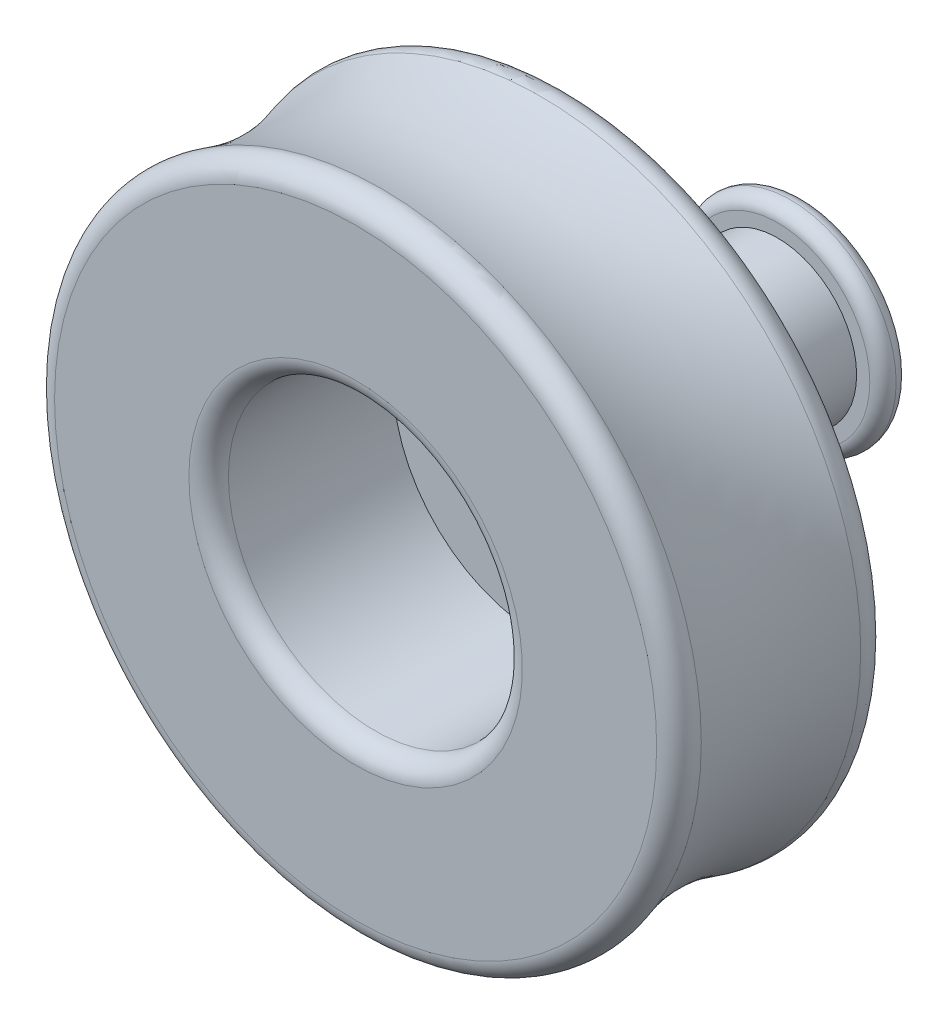
ISO-10303-21;
HEADER;
FILE_DESCRIPTION(('STEP AP214'),'2;1');
FILE_NAME('part.step','',(''),(''),'','','');
FILE_SCHEMA(('AUTOMOTIVE_DESIGN { 1 0 10303 214 1 1 1 1 }'));
ENDSEC;
DATA;
#1=APPLICATION_CONTEXT('core data for automotive mechanical design processes');
#2=APPLICATION_PROTOCOL_DEFINITION('international standard','automotive_design',2000,#1);
#3=PRODUCT_CONTEXT('',#1,'mechanical');
#4=PRODUCT('Part','Part','',(#3));
#5=PRODUCT_RELATED_PRODUCT_CATEGORY('part','',(#4));
#6=PRODUCT_DEFINITION_FORMATION('','',#4);
#7=PRODUCT_DEFINITION_CONTEXT('part definition',#1,'design');
#8=PRODUCT_DEFINITION('design','',#6,#7);
#9=PRODUCT_DEFINITION_SHAPE('','',#8);
#10=(LENGTH_UNIT() NAMED_UNIT(*) SI_UNIT(.MILLI.,.METRE.));
#11=(NAMED_UNIT(*) PLANE_ANGLE_UNIT() SI_UNIT($,.RADIAN.));
#12=(NAMED_UNIT(*) SI_UNIT($,.STERADIAN.) SOLID_ANGLE_UNIT());
#13=UNCERTAINTY_MEASURE_WITH_UNIT(LENGTH_MEASURE(1.E-05),#10,'distance_accuracy_value','');
#14=(GEOMETRIC_REPRESENTATION_CONTEXT(3) GLOBAL_UNCERTAINTY_ASSIGNED_CONTEXT((#13)) GLOBAL_UNIT_ASSIGNED_CONTEXT((#10,
#11,#12)) REPRESENTATION_CONTEXT('',''));
#15=CARTESIAN_POINT('',(0.,0.,0.));
#16=DIRECTION('',(0.,0.,1.));
#17=DIRECTION('',(1.,0.,0.));
#18=AXIS2_PLACEMENT_3D('',#15,#16,#17);
#19=CARTESIAN_POINT('',(0.,0.,-24.));
#20=DIRECTION('',(0.,0.,1.));
#21=DIRECTION('',(1.,0.,0.));
#22=AXIS2_PLACEMENT_3D('',#19,#20,#21);
#23=PLANE('',#22);
#24=CARTESIAN_POINT('',(12.5,0.,-24.));
#25=DIRECTION('',(0.,0.,1.));
#26=DIRECTION('',(1.,0.,0.));
#27=AXIS2_PLACEMENT_3D('',#24,#25,#26);
#28=CIRCLE('',#27,7.00000000000001);
#29=CARTESIAN_POINT('',(19.5,0.,-24.));
#30=VERTEX_POINT('',#29);
#31=EDGE_CURVE('E61',#30,#30,#28,.T.);
#32=ORIENTED_EDGE('',*,*,#31,.T.);
#33=EDGE_LOOP('',(#32));
#34=FACE_BOUND('',#33,.T.);
#35=CARTESIAN_POINT('',(12.5,0.,-24.));
#36=DIRECTION('',(0.,0.,1.));
#37=DIRECTION('',(1.,0.,0.));
#38=AXIS2_PLACEMENT_3D('',#35,#36,#37);
#39=CIRCLE('',#38,6.);
#40=CARTESIAN_POINT('',(18.5,0.,-24.));
#41=VERTEX_POINT('',#40);
#42=EDGE_CURVE('E116',#41,#41,#39,.T.);
#43=ORIENTED_EDGE('',*,*,#42,.F.);
#44=EDGE_LOOP('',(#43));
#45=FACE_BOUND('',#44,.T.);
#46=ADVANCED_FACE('F43',(#34,#45),#23,.T.);
#47=CARTESIAN_POINT('',(0.,0.,-26.));
#48=DIRECTION('',(0.,0.,1.));
#49=DIRECTION('',(1.,0.,0.));
#50=AXIS2_PLACEMENT_3D('',#47,#48,#49);
#51=PLANE('',#50);
#52=CARTESIAN_POINT('',(12.5,0.,-26.));
#53=DIRECTION('',(0.,0.,1.));
#54=DIRECTION('',(1.,0.,0.));
#55=AXIS2_PLACEMENT_3D('',#52,#53,#54);
#56=CIRCLE('',#55,5.75);
#57=CARTESIAN_POINT('',(18.25,0.,-26.));
#58=VERTEX_POINT('',#57);
#59=EDGE_CURVE('E51',#58,#58,#56,.T.);
#60=ORIENTED_EDGE('',*,*,#59,.T.);
#61=EDGE_LOOP('',(#60));
#62=FACE_BOUND('',#61,.T.);
#63=CARTESIAN_POINT('',(12.5,0.,-26.));
#64=DIRECTION('',(0.,0.,1.));
#65=DIRECTION('',(1.,0.,0.));
#66=AXIS2_PLACEMENT_3D('',#63,#64,#65);
#67=CIRCLE('',#66,7.00000000000001);
#68=CARTESIAN_POINT('',(19.5,0.,-26.));
#69=VERTEX_POINT('',#68);
#70=EDGE_CURVE('E56',#69,#69,#67,.F.);
#71=ORIENTED_EDGE('',*,*,#70,.T.);
#72=EDGE_LOOP('',(#71));
#73=FACE_BOUND('',#72,.T.);
#74=ADVANCED_FACE('F143',(#62,#73),#51,.F.);
#75=CARTESIAN_POINT('',(0.,0.,8.));
#76=DIRECTION('',(0.,0.,-1.));
#77=DIRECTION('',(-1.,0.,0.));
#78=AXIS2_PLACEMENT_3D('',#75,#76,#77);
#79=PLANE('',#78);
#80=CARTESIAN_POINT('',(12.5,0.,8.));
#81=DIRECTION('',(0.,0.,-1.));
#82=DIRECTION('',(-1.,0.,0.));
#83=AXIS2_PLACEMENT_3D('',#80,#81,#82);
#84=CIRCLE('',#83,22.8364012479042);
#85=CARTESIAN_POINT('',(-10.3364012479042,0.,8.));
#86=VERTEX_POINT('',#85);
#87=EDGE_CURVE('E88',#86,#86,#84,.F.);
#88=ORIENTED_EDGE('',*,*,#87,.T.);
#89=EDGE_LOOP('',(#88));
#90=FACE_BOUND('',#89,.T.);
#91=CARTESIAN_POINT('',(12.5,0.,8.));
#92=DIRECTION('',(0.,0.,-1.));
#93=DIRECTION('',(-1.,0.,0.));
#94=AXIS2_PLACEMENT_3D('',#91,#92,#93);
#95=CIRCLE('',#94,12.65);
#96=CARTESIAN_POINT('',(-0.150000000000003,0.,8.));
#97=VERTEX_POINT('',#96);
#98=EDGE_CURVE('E92',#97,#97,#95,.T.);
#99=ORIENTED_EDGE('',*,*,#98,.T.);
#100=EDGE_LOOP('',(#99));
#101=FACE_BOUND('',#100,.T.);
#102=ADVANCED_FACE('F156',(#90,#101),#79,.F.);
#103=CARTESIAN_POINT('',(12.5,0.,0.));
#104=DIRECTION('',(0.,0.,1.));
#105=DIRECTION('',(1.,0.,0.));
#106=AXIS2_PLACEMENT_3D('',#103,#104,#105);
#107=TOROIDAL_SURFACE('',#106,43.3303027798234,20.);
#108=CARTESIAN_POINT('',(12.5,0.,-6.04651162790698));
#109=DIRECTION('',(0.,0.,1.));
#110=DIRECTION('',(1.,0.,0.));
#111=AXIS2_PLACEMENT_3D('',#108,#109,#110);
#112=CIRCLE('',#111,24.2662083315264);
#113=CARTESIAN_POINT('',(36.7662083315264,0.,-6.04651162790698));
#114=VERTEX_POINT('',#113);
#115=EDGE_CURVE('E100',#114,#114,#112,.T.);
#116=ORIENTED_EDGE('',*,*,#115,.T.);
#117=EDGE_LOOP('',(#116));
#118=FACE_BOUND('',#117,.T.);
#119=CARTESIAN_POINT('',(12.5,0.,6.04651162790698));
#120=DIRECTION('',(0.,0.,-1.));
#121=DIRECTION('',(-1.,0.,0.));
#122=AXIS2_PLACEMENT_3D('',#119,#120,#121);
#123=CIRCLE('',#122,24.2662083315264);
#124=CARTESIAN_POINT('',(-11.7662083315264,0.,6.04651162790698));
#125=VERTEX_POINT('',#124);
#126=EDGE_CURVE('E104',#125,#125,#123,.T.);
#127=ORIENTED_EDGE('',*,*,#126,.T.);
#128=EDGE_LOOP('',(#127));
#129=FACE_BOUND('',#128,.T.);
#130=ADVANCED_FACE('F159',(#118,#129),#107,.F.);
#131=CARTESIAN_POINT('',(0.,0.,-8.));
#132=DIRECTION('',(0.,0.,-1.));
#133=DIRECTION('',(-1.,0.,0.));
#134=AXIS2_PLACEMENT_3D('',#131,#132,#133);
#135=PLANE('',#134);
#136=CARTESIAN_POINT('',(12.5,0.,-8.));
#137=DIRECTION('',(0.,0.,-1.));
#138=DIRECTION('',(-1.,0.,0.));
#139=AXIS2_PLACEMENT_3D('',#136,#137,#138);
#140=CIRCLE('',#139,22.8364012479042);
#141=CARTESIAN_POINT('',(-10.3364012479042,0.,-8.));
#142=VERTEX_POINT('',#141);
#143=EDGE_CURVE('E96',#142,#142,#140,.T.);
#144=ORIENTED_EDGE('',*,*,#143,.T.);
#145=EDGE_LOOP('',(#144));
#146=FACE_BOUND('',#145,.T.);
#147=CARTESIAN_POINT('',(12.5,0.,-8.));
#148=DIRECTION('',(0.,0.,1.));
#149=DIRECTION('',(1.,0.,0.));
#150=AXIS2_PLACEMENT_3D('',#147,#148,#149);
#151=CIRCLE('',#150,6.);
#152=CARTESIAN_POINT('',(18.5,0.,-8.));
#153=VERTEX_POINT('',#152);
#154=EDGE_CURVE('E128',#153,#153,#151,.T.);
#155=ORIENTED_EDGE('',*,*,#154,.T.);
#156=EDGE_LOOP('',(#155));
#157=FACE_BOUND('',#156,.T.);
#158=ADVANCED_FACE('F165',(#146,#157),#135,.T.);
#159=CARTESIAN_POINT('',(12.5,0.,8.));
#160=DIRECTION('',(0.,0.,1.));
#161=DIRECTION('',(1.,0.,0.));
#162=AXIS2_PLACEMENT_3D('',#159,#160,#161);
#163=CYLINDRICAL_SURFACE('',#162,6.);
#164=CARTESIAN_POINT('',(12.5,0.,-15.));
#165=DIRECTION('',(0.,0.,1.));
#166=DIRECTION('',(1.,0.,0.));
#167=AXIS2_PLACEMENT_3D('',#164,#165,#166);
#168=CIRCLE('',#167,6.);
#169=CARTESIAN_POINT('',(18.5,0.,-15.));
#170=VERTEX_POINT('',#169);
#171=EDGE_CURVE('E124',#170,#170,#168,.T.);
#172=ORIENTED_EDGE('',*,*,#171,.T.);
#173=EDGE_LOOP('',(#172));
#174=FACE_BOUND('',#173,.T.);
#175=ORIENTED_EDGE('',*,*,#154,.F.);
#176=EDGE_LOOP('',(#175));
#177=FACE_BOUND('',#176,.T.);
#178=ADVANCED_FACE('F173',(#174,#177),#163,.T.);
#179=CARTESIAN_POINT('',(0.,0.,-15.));
#180=DIRECTION('',(0.,0.,1.));
#181=DIRECTION('',(1.,0.,0.));
#182=AXIS2_PLACEMENT_3D('',#179,#180,#181);
#183=PLANE('',#182);
#184=CARTESIAN_POINT('',(12.5,0.,-15.));
#185=DIRECTION('',(0.,0.,1.));
#186=DIRECTION('',(1.,0.,0.));
#187=AXIS2_PLACEMENT_3D('',#184,#185,#186);
#188=CIRCLE('',#187,7.);
#189=CARTESIAN_POINT('',(19.5,0.,-15.));
#190=VERTEX_POINT('',#189);
#191=EDGE_CURVE('E80',#190,#190,#188,.T.);
#192=ORIENTED_EDGE('',*,*,#191,.T.);
#193=EDGE_LOOP('',(#192));
#194=FACE_BOUND('',#193,.T.);
#195=ORIENTED_EDGE('',*,*,#171,.F.);
#196=EDGE_LOOP('',(#195));
#197=FACE_BOUND('',#196,.T.);
#198=ADVANCED_FACE('F220',(#194,#197),#183,.T.);
#199=CARTESIAN_POINT('',(0.,0.,-17.));
#200=DIRECTION('',(0.,0.,1.));
#201=DIRECTION('',(1.,0.,0.));
#202=AXIS2_PLACEMENT_3D('',#199,#200,#201);
#203=PLANE('',#202);
#204=CARTESIAN_POINT('',(12.5,0.,-17.));
#205=DIRECTION('',(0.,0.,1.));
#206=DIRECTION('',(1.,0.,0.));
#207=AXIS2_PLACEMENT_3D('',#204,#205,#206);
#208=CIRCLE('',#207,7.);
#209=CARTESIAN_POINT('',(19.5,0.,-17.));
#210=VERTEX_POINT('',#209);
#211=EDGE_CURVE('E76',#210,#210,#208,.F.);
#212=ORIENTED_EDGE('',*,*,#211,.T.);
#213=EDGE_LOOP('',(#212));
#214=FACE_BOUND('',#213,.T.);
#215=CARTESIAN_POINT('',(12.5,0.,-17.));
#216=DIRECTION('',(0.,0.,1.));
#217=DIRECTION('',(1.,0.,0.));
#218=AXIS2_PLACEMENT_3D('',#215,#216,#217);
#219=CIRCLE('',#218,6.);
#220=CARTESIAN_POINT('',(18.5,0.,-17.));
#221=VERTEX_POINT('',#220);
#222=EDGE_CURVE('E120',#221,#221,#219,.T.);
#223=ORIENTED_EDGE('',*,*,#222,.T.);
#224=EDGE_LOOP('',(#223));
#225=FACE_BOUND('',#224,.T.);
#226=ADVANCED_FACE('F151',(#214,#225),#203,.F.);
#227=CARTESIAN_POINT('',(12.5,0.,8.));
#228=DIRECTION('',(0.,0.,1.));
#229=DIRECTION('',(1.,0.,0.));
#230=AXIS2_PLACEMENT_3D('',#227,#228,#229);
#231=CYLINDRICAL_SURFACE('',#230,6.);
#232=ORIENTED_EDGE('',*,*,#42,.T.);
#233=EDGE_LOOP('',(#232));
#234=FACE_BOUND('',#233,.T.);
#235=ORIENTED_EDGE('',*,*,#222,.F.);
#236=EDGE_LOOP('',(#235));
#237=FACE_BOUND('',#236,.T.);
#238=ADVANCED_FACE('F140',(#234,#237),#231,.T.);
#239=CARTESIAN_POINT('',(12.5,0.,-6.));
#240=DIRECTION('',(0.,0.,1.));
#241=DIRECTION('',(1.,0.,0.));
#242=AXIS2_PLACEMENT_3D('',#239,#240,#241);
#243=CYLINDRICAL_SURFACE('',#242,11.15);
#244=CARTESIAN_POINT('',(12.5,0.,6.5));
#245=DIRECTION('',(0.,0.,-1.));
#246=DIRECTION('',(-1.,0.,0.));
#247=AXIS2_PLACEMENT_3D('',#244,#245,#246);
#248=CIRCLE('',#247,11.15);
#249=CARTESIAN_POINT('',(1.35,0.,6.5));
#250=VERTEX_POINT('',#249);
#251=EDGE_CURVE('E84',#250,#250,#248,.F.);
#252=ORIENTED_EDGE('',*,*,#251,.T.);
#253=EDGE_LOOP('',(#252));
#254=FACE_BOUND('',#253,.T.);
#255=CARTESIAN_POINT('',(12.5,0.,-6.));
#256=DIRECTION('',(0.,0.,1.));
#257=DIRECTION('',(1.,0.,0.));
#258=AXIS2_PLACEMENT_3D('',#255,#256,#257);
#259=CIRCLE('',#258,11.15);
#260=CARTESIAN_POINT('',(23.65,0.,-6.));
#261=VERTEX_POINT('',#260);
#262=EDGE_CURVE('E71',#261,#261,#259,.T.);
#263=ORIENTED_EDGE('',*,*,#262,.F.);
#264=EDGE_LOOP('',(#263));
#265=FACE_BOUND('',#264,.T.);
#266=ADVANCED_FACE('F138',(#254,#265),#243,.F.);
#267=CARTESIAN_POINT('',(12.5,0.,-6.));
#268=DIRECTION('',(0.,0.,1.));
#269=DIRECTION('',(1.,0.,0.));
#270=AXIS2_PLACEMENT_3D('',#267,#268,#269);
#271=PLANE('',#270);
#272=CARTESIAN_POINT('',(12.5,0.,-6.));
#273=DIRECTION('',(0.,0.,1.));
#274=DIRECTION('',(1.,0.,0.));
#275=AXIS2_PLACEMENT_3D('',#272,#273,#274);
#276=CIRCLE('',#275,5.75);
#277=CARTESIAN_POINT('',(18.25,0.,-6.));
#278=VERTEX_POINT('',#277);
#279=EDGE_CURVE('E108',#278,#278,#276,.F.);
#280=ORIENTED_EDGE('',*,*,#279,.T.);
#281=EDGE_LOOP('',(#280));
#282=FACE_BOUND('',#281,.T.);
#283=ORIENTED_EDGE('',*,*,#262,.T.);
#284=EDGE_LOOP('',(#283));
#285=FACE_BOUND('',#284,.T.);
#286=ADVANCED_FACE('F136',(#282,#285),#271,.T.);
#287=CARTESIAN_POINT('',(12.5,0.,-26.));
#288=DIRECTION('',(0.,0.,1.));
#289=DIRECTION('',(1.,0.,0.));
#290=AXIS2_PLACEMENT_3D('',#287,#288,#289);
#291=CYLINDRICAL_SURFACE('',#290,4.25);
#292=CARTESIAN_POINT('',(12.5,0.,-24.5));
#293=DIRECTION('',(0.,0.,1.));
#294=DIRECTION('',(1.,0.,0.));
#295=AXIS2_PLACEMENT_3D('',#292,#293,#294);
#296=CIRCLE('',#295,4.25);
#297=CARTESIAN_POINT('',(16.75,0.,-24.5));
#298=VERTEX_POINT('',#297);
#299=EDGE_CURVE('E10',#298,#298,#296,.F.);
#300=ORIENTED_EDGE('',*,*,#299,.T.);
#301=EDGE_LOOP('',(#300));
#302=FACE_BOUND('',#301,.T.);
#303=CARTESIAN_POINT('',(12.5,0.,-7.5));
#304=DIRECTION('',(0.,0.,1.));
#305=DIRECTION('',(1.,0.,0.));
#306=AXIS2_PLACEMENT_3D('',#303,#304,#305);
#307=CIRCLE('',#306,4.25);
#308=CARTESIAN_POINT('',(16.75,0.,-7.5));
#309=VERTEX_POINT('',#308);
#310=EDGE_CURVE('E112',#309,#309,#307,.T.);
#311=ORIENTED_EDGE('',*,*,#310,.T.);
#312=EDGE_LOOP('',(#311));
#313=FACE_BOUND('',#312,.T.);
#314=ADVANCED_FACE('F148',(#302,#313),#291,.F.);
#315=CARTESIAN_POINT('',(12.5,0.,-7.5));
#316=DIRECTION('',(0.,0.,1.));
#317=DIRECTION('',(1.,0.,0.));
#318=AXIS2_PLACEMENT_3D('',#315,#316,#317);
#319=TOROIDAL_SURFACE('',#318,5.75,1.5);
#320=ORIENTED_EDGE('',*,*,#279,.F.);
#321=EDGE_LOOP('',(#320));
#322=FACE_BOUND('',#321,.T.);
#323=ORIENTED_EDGE('',*,*,#310,.F.);
#324=EDGE_LOOP('',(#323));
#325=FACE_BOUND('',#324,.T.);
#326=ADVANCED_FACE('F175',(#322,#325),#319,.T.);
#327=CARTESIAN_POINT('',(12.5,0.,-6.5));
#328=DIRECTION('',(0.,0.,1.));
#329=DIRECTION('',(1.,0.,0.));
#330=AXIS2_PLACEMENT_3D('',#327,#328,#329);
#331=TOROIDAL_SURFACE('',#330,22.8364012479042,1.5);
#332=ORIENTED_EDGE('',*,*,#143,.F.);
#333=EDGE_LOOP('',(#332));
#334=FACE_BOUND('',#333,.T.);
#335=ORIENTED_EDGE('',*,*,#115,.F.);
#336=EDGE_LOOP('',(#335));
#337=FACE_BOUND('',#336,.T.);
#338=ADVANCED_FACE('F178',(#334,#337),#331,.T.);
#339=CARTESIAN_POINT('',(12.5,0.,6.5));
#340=DIRECTION('',(0.,0.,1.));
#341=DIRECTION('',(1.,0.,0.));
#342=AXIS2_PLACEMENT_3D('',#339,#340,#341);
#343=TOROIDAL_SURFACE('',#342,22.8364012479042,1.5);
#344=ORIENTED_EDGE('',*,*,#126,.F.);
#345=EDGE_LOOP('',(#344));
#346=FACE_BOUND('',#345,.T.);
#347=ORIENTED_EDGE('',*,*,#87,.F.);
#348=EDGE_LOOP('',(#347));
#349=FACE_BOUND('',#348,.T.);
#350=ADVANCED_FACE('F182',(#346,#349),#343,.T.);
#351=CARTESIAN_POINT('',(12.5,0.,6.5));
#352=DIRECTION('',(0.,0.,-1.));
#353=DIRECTION('',(-1.,0.,0.));
#354=AXIS2_PLACEMENT_3D('',#351,#352,#353);
#355=TOROIDAL_SURFACE('',#354,12.65,1.5);
#356=ORIENTED_EDGE('',*,*,#98,.F.);
#357=EDGE_LOOP('',(#356));
#358=FACE_BOUND('',#357,.T.);
#359=ORIENTED_EDGE('',*,*,#251,.F.);
#360=EDGE_LOOP('',(#359));
#361=FACE_BOUND('',#360,.T.);
#362=ADVANCED_FACE('F186',(#358,#361),#355,.T.);
#363=CARTESIAN_POINT('',(12.5,0.,-16.));
#364=DIRECTION('',(0.,0.,1.));
#365=DIRECTION('',(1.,0.,0.));
#366=AXIS2_PLACEMENT_3D('',#363,#364,#365);
#367=TOROIDAL_SURFACE('',#366,7.,1.);
#368=ORIENTED_EDGE('',*,*,#211,.F.);
#369=EDGE_LOOP('',(#368));
#370=FACE_BOUND('',#369,.T.);
#371=CARTESIAN_POINT('',(12.5,0.,-16.));
#372=DIRECTION('',(0.,0.,1.));
#373=DIRECTION('',(1.,0.,0.));
#374=AXIS2_PLACEMENT_3D('',#371,#372,#373);
#375=CIRCLE('',#374,8.);
#376=CARTESIAN_POINT('',(20.5,0.,-16.));
#377=VERTEX_POINT('',#376);
#378=EDGE_CURVE('E68',#377,#377,#375,.T.);
#379=ORIENTED_EDGE('',*,*,#378,.F.);
#380=EDGE_LOOP('',(#379));
#381=FACE_BOUND('',#380,.T.);
#382=ADVANCED_FACE('F190',(#370,#381),#367,.T.);
#383=CARTESIAN_POINT('',(12.5,0.,-16.));
#384=DIRECTION('',(0.,0.,1.));
#385=DIRECTION('',(1.,0.,0.));
#386=AXIS2_PLACEMENT_3D('',#383,#384,#385);
#387=TOROIDAL_SURFACE('',#386,7.,1.);
#388=ORIENTED_EDGE('',*,*,#378,.T.);
#389=EDGE_LOOP('',(#388));
#390=FACE_BOUND('',#389,.T.);
#391=ORIENTED_EDGE('',*,*,#191,.F.);
#392=EDGE_LOOP('',(#391));
#393=FACE_BOUND('',#392,.T.);
#394=ADVANCED_FACE('F192',(#390,#393),#387,.T.);
#395=CARTESIAN_POINT('',(12.5,0.,-25.));
#396=DIRECTION('',(0.,0.,1.));
#397=DIRECTION('',(1.,0.,0.));
#398=AXIS2_PLACEMENT_3D('',#395,#396,#397);
#399=TOROIDAL_SURFACE('',#398,7.00000000000001,1.);
#400=ORIENTED_EDGE('',*,*,#70,.F.);
#401=EDGE_LOOP('',(#400));
#402=FACE_BOUND('',#401,.T.);
#403=CARTESIAN_POINT('',(12.5,0.,-25.));
#404=DIRECTION('',(0.,0.,1.));
#405=DIRECTION('',(1.,0.,0.));
#406=AXIS2_PLACEMENT_3D('',#403,#404,#405);
#407=CIRCLE('',#406,8.00000000000001);
#408=CARTESIAN_POINT('',(20.5,0.,-25.));
#409=VERTEX_POINT('',#408);
#410=EDGE_CURVE('E64',#409,#409,#407,.T.);
#411=ORIENTED_EDGE('',*,*,#410,.F.);
#412=EDGE_LOOP('',(#411));
#413=FACE_BOUND('',#412,.T.);
#414=ADVANCED_FACE('F195',(#402,#413),#399,.T.);
#415=CARTESIAN_POINT('',(12.5,0.,-25.));
#416=DIRECTION('',(0.,0.,1.));
#417=DIRECTION('',(1.,0.,0.));
#418=AXIS2_PLACEMENT_3D('',#415,#416,#417);
#419=TOROIDAL_SURFACE('',#418,7.00000000000001,1.);
#420=ORIENTED_EDGE('',*,*,#410,.T.);
#421=EDGE_LOOP('',(#420));
#422=FACE_BOUND('',#421,.T.);
#423=ORIENTED_EDGE('',*,*,#31,.F.);
#424=EDGE_LOOP('',(#423));
#425=FACE_BOUND('',#424,.T.);
#426=ADVANCED_FACE('F200',(#422,#425),#419,.T.);
#427=CARTESIAN_POINT('',(12.5,0.,-24.5));
#428=DIRECTION('',(0.,0.,1.));
#429=DIRECTION('',(1.,0.,0.));
#430=AXIS2_PLACEMENT_3D('',#427,#428,#429);
#431=TOROIDAL_SURFACE('',#430,5.75,1.5);
#432=ORIENTED_EDGE('',*,*,#299,.F.);
#433=EDGE_LOOP('',(#432));
#434=FACE_BOUND('',#433,.T.);
#435=ORIENTED_EDGE('',*,*,#59,.F.);
#436=EDGE_LOOP('',(#435));
#437=FACE_BOUND('',#436,.T.);
#438=ADVANCED_FACE('F45',(#434,#437),#431,.T.);
#439=CLOSED_SHELL('',(#46,#74,#102,#130,#158,#178,#198,#226,#238,#266,#286,#314,#326,#338,#350,
#362,#382,#394,#414,#426,#438));
#440=MANIFOLD_SOLID_BREP('B2',#439);
#441=ADVANCED_BREP_SHAPE_REPRESENTATION('',(#18,#440),#14);
#442=SHAPE_DEFINITION_REPRESENTATION(#9,#441);
ENDSEC;
END-ISO-10303-21;
